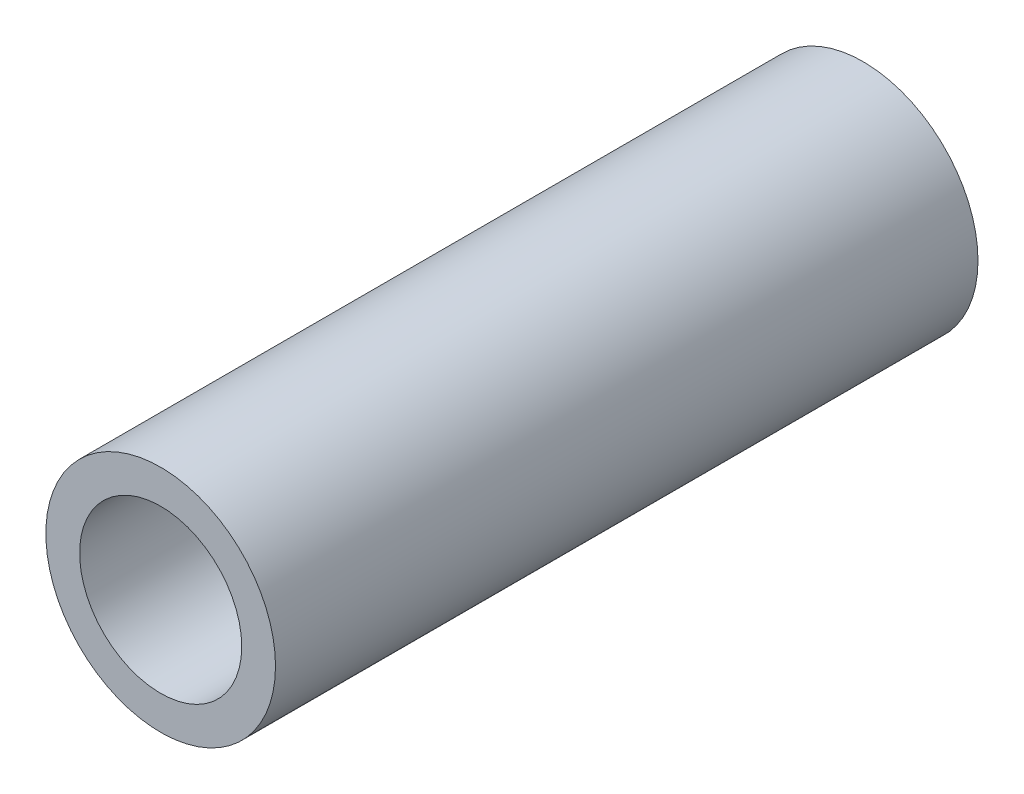
ISO-10303-21;
HEADER;
FILE_DESCRIPTION(('STEP AP214'),'2;1');
FILE_NAME('part.step','',(''),(''),'','','');
FILE_SCHEMA(('AUTOMOTIVE_DESIGN { 1 0 10303 214 1 1 1 1 }'));
ENDSEC;
DATA;
#1=APPLICATION_CONTEXT('core data for automotive mechanical design processes');
#2=APPLICATION_PROTOCOL_DEFINITION('international standard','automotive_design',2000,#1);
#3=PRODUCT_CONTEXT('',#1,'mechanical');
#4=PRODUCT('Part','Part','',(#3));
#5=PRODUCT_RELATED_PRODUCT_CATEGORY('part','',(#4));
#6=PRODUCT_DEFINITION_FORMATION('','',#4);
#7=PRODUCT_DEFINITION_CONTEXT('part definition',#1,'design');
#8=PRODUCT_DEFINITION('design','',#6,#7);
#9=PRODUCT_DEFINITION_SHAPE('','',#8);
#10=(LENGTH_UNIT() NAMED_UNIT(*) SI_UNIT(.MILLI.,.METRE.));
#11=(NAMED_UNIT(*) PLANE_ANGLE_UNIT() SI_UNIT($,.RADIAN.));
#12=(NAMED_UNIT(*) SI_UNIT($,.STERADIAN.) SOLID_ANGLE_UNIT());
#13=UNCERTAINTY_MEASURE_WITH_UNIT(LENGTH_MEASURE(1.E-05),#10,'distance_accuracy_value','');
#14=(GEOMETRIC_REPRESENTATION_CONTEXT(3) GLOBAL_UNCERTAINTY_ASSIGNED_CONTEXT((#13)) GLOBAL_UNIT_ASSIGNED_CONTEXT((#10,
#11,#12)) REPRESENTATION_CONTEXT('',''));
#15=CARTESIAN_POINT('',(0.,0.,0.));
#16=DIRECTION('',(0.,0.,1.));
#17=DIRECTION('',(1.,0.,0.));
#18=AXIS2_PLACEMENT_3D('',#15,#16,#17);
#19=CARTESIAN_POINT('',(0.,0.,0.));
#20=DIRECTION('',(0.,0.,1.));
#21=DIRECTION('',(1.,0.,0.));
#22=AXIS2_PLACEMENT_3D('',#19,#20,#21);
#23=PLANE('',#22);
#24=CARTESIAN_POINT('',(0.,0.,0.));
#25=DIRECTION('',(0.,0.,1.));
#26=DIRECTION('',(1.,0.,0.));
#27=AXIS2_PLACEMENT_3D('',#24,#25,#26);
#28=CIRCLE('',#27,9.525);
#29=CARTESIAN_POINT('',(9.525,0.,0.));
#30=VERTEX_POINT('',#29);
#31=EDGE_CURVE('E68',#30,#30,#28,.F.);
#32=ORIENTED_EDGE('',*,*,#31,.F.);
#33=EDGE_LOOP('',(#32));
#34=FACE_BOUND('',#33,.T.);
#35=CARTESIAN_POINT('',(0.,0.,0.));
#36=DIRECTION('',(0.,0.,1.));
#37=DIRECTION('',(1.,0.,0.));
#38=AXIS2_PLACEMENT_3D('',#35,#36,#37);
#39=CIRCLE('',#38,13.49375);
#40=CARTESIAN_POINT('',(13.49375,0.,0.));
#41=VERTEX_POINT('',#40);
#42=EDGE_CURVE('E58',#41,#41,#39,.T.);
#43=ORIENTED_EDGE('',*,*,#42,.F.);
#44=EDGE_LOOP('',(#43));
#45=FACE_BOUND('',#44,.T.);
#46=ADVANCED_FACE('F51',(#34,#45),#23,.F.);
#47=CARTESIAN_POINT('',(0.,0.,82.55));
#48=DIRECTION('',(0.,0.,1.));
#49=DIRECTION('',(1.,0.,0.));
#50=AXIS2_PLACEMENT_3D('',#47,#48,#49);
#51=PLANE('',#50);
#52=CARTESIAN_POINT('',(0.,0.,82.55));
#53=DIRECTION('',(0.,0.,1.));
#54=DIRECTION('',(1.,0.,0.));
#55=AXIS2_PLACEMENT_3D('',#52,#53,#54);
#56=CIRCLE('',#55,9.525);
#57=CARTESIAN_POINT('',(9.525,0.,82.55));
#58=VERTEX_POINT('',#57);
#59=EDGE_CURVE('E63',#58,#58,#56,.F.);
#60=ORIENTED_EDGE('',*,*,#59,.T.);
#61=EDGE_LOOP('',(#60));
#62=FACE_BOUND('',#61,.T.);
#63=CARTESIAN_POINT('',(0.,0.,82.55));
#64=DIRECTION('',(0.,0.,1.));
#65=DIRECTION('',(1.,0.,0.));
#66=AXIS2_PLACEMENT_3D('',#63,#64,#65);
#67=CIRCLE('',#66,13.49375);
#68=CARTESIAN_POINT('',(13.49375,0.,82.55));
#69=VERTEX_POINT('',#68);
#70=EDGE_CURVE('E11',#69,#69,#67,.T.);
#71=ORIENTED_EDGE('',*,*,#70,.T.);
#72=EDGE_LOOP('',(#71));
#73=FACE_BOUND('',#72,.T.);
#74=ADVANCED_FACE('F80',(#62,#73),#51,.T.);
#75=CARTESIAN_POINT('',(0.,0.,0.));
#76=DIRECTION('',(0.,0.,1.));
#77=DIRECTION('',(1.,0.,0.));
#78=AXIS2_PLACEMENT_3D('',#75,#76,#77);
#79=CYLINDRICAL_SURFACE('',#78,13.49375);
#80=ORIENTED_EDGE('',*,*,#70,.F.);
#81=EDGE_LOOP('',(#80));
#82=FACE_BOUND('',#81,.T.);
#83=ORIENTED_EDGE('',*,*,#42,.T.);
#84=EDGE_LOOP('',(#83));
#85=FACE_BOUND('',#84,.T.);
#86=ADVANCED_FACE('F84',(#82,#85),#79,.T.);
#87=CARTESIAN_POINT('',(0.,0.,-1.));
#88=DIRECTION('',(0.,0.,1.));
#89=DIRECTION('',(1.,0.,0.));
#90=AXIS2_PLACEMENT_3D('',#87,#88,#89);
#91=CYLINDRICAL_SURFACE('',#90,9.525);
#92=ORIENTED_EDGE('',*,*,#31,.T.);
#93=EDGE_LOOP('',(#92));
#94=FACE_BOUND('',#93,.T.);
#95=ORIENTED_EDGE('',*,*,#59,.F.);
#96=EDGE_LOOP('',(#95));
#97=FACE_BOUND('',#96,.T.);
#98=ADVANCED_FACE('F75',(#94,#97),#91,.F.);
#99=CLOSED_SHELL('',(#46,#74,#86,#98));
#100=MANIFOLD_SOLID_BREP('B2',#99);
#101=ADVANCED_BREP_SHAPE_REPRESENTATION('',(#18,#100),#14);
#102=SHAPE_DEFINITION_REPRESENTATION(#9,#101);
ENDSEC;
END-ISO-10303-21;
